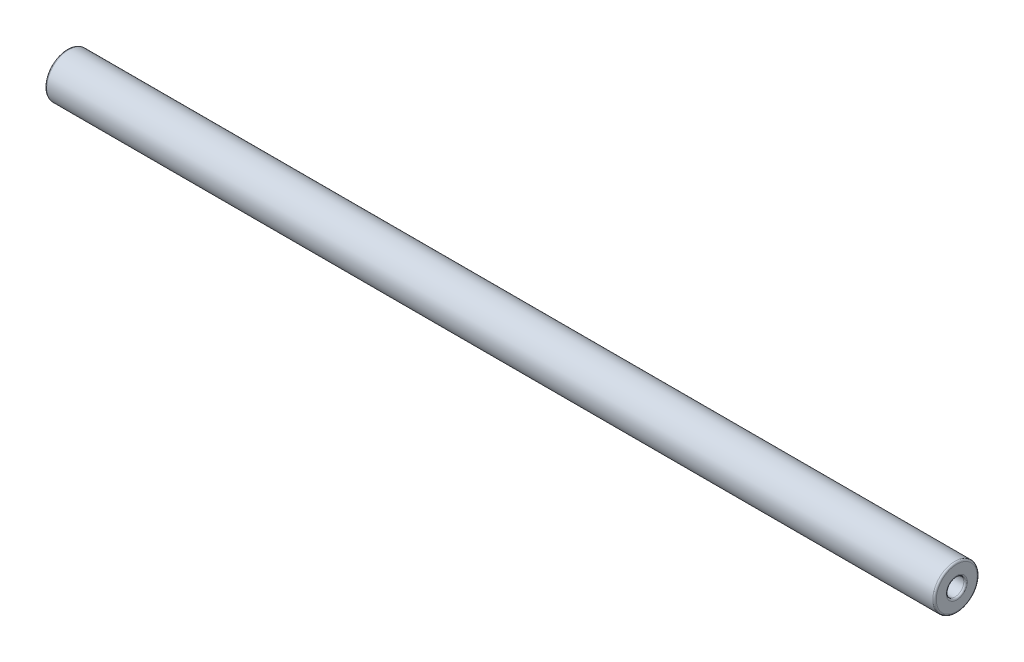
ISO-10303-21;
HEADER;
FILE_DESCRIPTION(('STEP AP214'),'2;1');
FILE_NAME('part.step','',(''),(''),'','','');
FILE_SCHEMA(('AUTOMOTIVE_DESIGN { 1 0 10303 214 1 1 1 1 }'));
ENDSEC;
DATA;
#1=APPLICATION_CONTEXT('core data for automotive mechanical design processes');
#2=APPLICATION_PROTOCOL_DEFINITION('international standard','automotive_design',2000,#1);
#3=PRODUCT_CONTEXT('',#1,'mechanical');
#4=PRODUCT('Part','Part','',(#3));
#5=PRODUCT_RELATED_PRODUCT_CATEGORY('part','',(#4));
#6=PRODUCT_DEFINITION_FORMATION('','',#4);
#7=PRODUCT_DEFINITION_CONTEXT('part definition',#1,'design');
#8=PRODUCT_DEFINITION('design','',#6,#7);
#9=PRODUCT_DEFINITION_SHAPE('','',#8);
#10=(LENGTH_UNIT() NAMED_UNIT(*) SI_UNIT(.MILLI.,.METRE.));
#11=(NAMED_UNIT(*) PLANE_ANGLE_UNIT() SI_UNIT($,.RADIAN.));
#12=(NAMED_UNIT(*) SI_UNIT($,.STERADIAN.) SOLID_ANGLE_UNIT());
#13=UNCERTAINTY_MEASURE_WITH_UNIT(LENGTH_MEASURE(1.E-05),#10,'distance_accuracy_value','');
#14=(GEOMETRIC_REPRESENTATION_CONTEXT(3) GLOBAL_UNCERTAINTY_ASSIGNED_CONTEXT((#13)) GLOBAL_UNIT_ASSIGNED_CONTEXT((#10,
#11,#12)) REPRESENTATION_CONTEXT('',''));
#15=CARTESIAN_POINT('',(0.,0.,0.));
#16=DIRECTION('',(0.,0.,1.));
#17=DIRECTION('',(1.,0.,0.));
#18=AXIS2_PLACEMENT_3D('',#15,#16,#17);
#19=CARTESIAN_POINT('',(127.,0.,0.));
#20=DIRECTION('',(1.,0.,0.));
#21=DIRECTION('',(0.,0.,-1.));
#22=AXIS2_PLACEMENT_3D('',#19,#20,#21);
#23=PLANE('',#22);
#24=CARTESIAN_POINT('',(127.,0.,0.));
#25=DIRECTION('',(1.,0.,0.));
#26=DIRECTION('',(0.,0.,-1.));
#27=AXIS2_PLACEMENT_3D('',#24,#25,#26);
#28=CIRCLE('',#27,3.);
#29=CARTESIAN_POINT('',(127.,0.,-3.));
#30=VERTEX_POINT('',#29);
#31=EDGE_CURVE('E10',#30,#30,#28,.F.);
#32=ORIENTED_EDGE('',*,*,#31,.T.);
#33=EDGE_LOOP('',(#32));
#34=FACE_BOUND('',#33,.T.);
#35=CARTESIAN_POINT('',(127.,0.,0.));
#36=DIRECTION('',(1.,0.,0.));
#37=DIRECTION('',(0.,0.,-1.));
#38=AXIS2_PLACEMENT_3D('',#35,#36,#37);
#39=CIRCLE('',#38,5.85);
#40=CARTESIAN_POINT('',(127.,0.,-5.85));
#41=VERTEX_POINT('',#40);
#42=EDGE_CURVE('E45',#41,#41,#39,.T.);
#43=ORIENTED_EDGE('',*,*,#42,.T.);
#44=EDGE_LOOP('',(#43));
#45=FACE_BOUND('',#44,.T.);
#46=ADVANCED_FACE('F37',(#34,#45),#23,.T.);
#47=CARTESIAN_POINT('',(-127.,0.,0.));
#48=DIRECTION('',(1.,0.,0.));
#49=DIRECTION('',(0.,0.,-1.));
#50=AXIS2_PLACEMENT_3D('',#47,#48,#49);
#51=PLANE('',#50);
#52=CARTESIAN_POINT('',(-127.,0.,0.));
#53=DIRECTION('',(1.,0.,0.));
#54=DIRECTION('',(0.,0.,-1.));
#55=AXIS2_PLACEMENT_3D('',#52,#53,#54);
#56=CIRCLE('',#55,3.);
#57=CARTESIAN_POINT('',(-127.,0.,-3.));
#58=VERTEX_POINT('',#57);
#59=EDGE_CURVE('E69',#58,#58,#56,.T.);
#60=ORIENTED_EDGE('',*,*,#59,.T.);
#61=EDGE_LOOP('',(#60));
#62=FACE_BOUND('',#61,.T.);
#63=CARTESIAN_POINT('',(-127.,0.,0.));
#64=DIRECTION('',(1.,0.,0.));
#65=DIRECTION('',(0.,0.,-1.));
#66=AXIS2_PLACEMENT_3D('',#63,#64,#65);
#67=CIRCLE('',#66,5.85);
#68=CARTESIAN_POINT('',(-127.,0.,-5.85));
#69=VERTEX_POINT('',#68);
#70=EDGE_CURVE('E73',#69,#69,#67,.F.);
#71=ORIENTED_EDGE('',*,*,#70,.T.);
#72=EDGE_LOOP('',(#71));
#73=FACE_BOUND('',#72,.T.);
#74=ADVANCED_FACE('F78',(#62,#73),#51,.F.);
#75=CARTESIAN_POINT('',(127.,0.,0.));
#76=DIRECTION('',(-1.,0.,0.));
#77=DIRECTION('',(0.,0.,1.));
#78=AXIS2_PLACEMENT_3D('',#75,#76,#77);
#79=CYLINDRICAL_SURFACE('',#78,6.35);
#80=CARTESIAN_POINT('',(-126.5,0.,0.));
#81=DIRECTION('',(1.,0.,0.));
#82=DIRECTION('',(0.,0.,-1.));
#83=AXIS2_PLACEMENT_3D('',#80,#81,#82);
#84=CIRCLE('',#83,6.35);
#85=CARTESIAN_POINT('',(-126.5,0.,-6.35));
#86=VERTEX_POINT('',#85);
#87=EDGE_CURVE('E50',#86,#86,#84,.T.);
#88=ORIENTED_EDGE('',*,*,#87,.T.);
#89=EDGE_LOOP('',(#88));
#90=FACE_BOUND('',#89,.T.);
#91=CARTESIAN_POINT('',(126.5,0.,0.));
#92=DIRECTION('',(1.,0.,0.));
#93=DIRECTION('',(0.,0.,-1.));
#94=AXIS2_PLACEMENT_3D('',#91,#92,#93);
#95=CIRCLE('',#94,6.35);
#96=CARTESIAN_POINT('',(126.5,0.,-6.35));
#97=VERTEX_POINT('',#96);
#98=EDGE_CURVE('E55',#97,#97,#95,.F.);
#99=ORIENTED_EDGE('',*,*,#98,.T.);
#100=EDGE_LOOP('',(#99));
#101=FACE_BOUND('',#100,.T.);
#102=ADVANCED_FACE('F88',(#90,#101),#79,.T.);
#103=CARTESIAN_POINT('',(127.,0.,0.));
#104=DIRECTION('',(-1.,0.,0.));
#105=DIRECTION('',(0.,0.,1.));
#106=AXIS2_PLACEMENT_3D('',#103,#104,#105);
#107=CYLINDRICAL_SURFACE('',#106,2.5);
#108=CARTESIAN_POINT('',(-126.5,0.,0.));
#109=DIRECTION('',(1.,0.,0.));
#110=DIRECTION('',(0.,0.,-1.));
#111=AXIS2_PLACEMENT_3D('',#108,#109,#110);
#112=CIRCLE('',#111,2.5);
#113=CARTESIAN_POINT('',(-126.5,0.,-2.5));
#114=VERTEX_POINT('',#113);
#115=EDGE_CURVE('E61',#114,#114,#112,.F.);
#116=ORIENTED_EDGE('',*,*,#115,.T.);
#117=EDGE_LOOP('',(#116));
#118=FACE_BOUND('',#117,.T.);
#119=CARTESIAN_POINT('',(126.5,0.,0.));
#120=DIRECTION('',(1.,0.,0.));
#121=DIRECTION('',(0.,0.,-1.));
#122=AXIS2_PLACEMENT_3D('',#119,#120,#121);
#123=CIRCLE('',#122,2.5);
#124=CARTESIAN_POINT('',(126.5,0.,-2.5));
#125=VERTEX_POINT('',#124);
#126=EDGE_CURVE('E65',#125,#125,#123,.T.);
#127=ORIENTED_EDGE('',*,*,#126,.T.);
#128=EDGE_LOOP('',(#127));
#129=FACE_BOUND('',#128,.T.);
#130=ADVANCED_FACE('F91',(#118,#129),#107,.F.);
#131=CARTESIAN_POINT('',(-126.5,0.,0.));
#132=DIRECTION('',(1.,0.,0.));
#133=DIRECTION('',(0.,0.,-1.));
#134=AXIS2_PLACEMENT_3D('',#131,#132,#133);
#135=TOROIDAL_SURFACE('',#134,3.,0.5);
#136=ORIENTED_EDGE('',*,*,#115,.F.);
#137=EDGE_LOOP('',(#136));
#138=FACE_BOUND('',#137,.T.);
#139=ORIENTED_EDGE('',*,*,#59,.F.);
#140=EDGE_LOOP('',(#139));
#141=FACE_BOUND('',#140,.T.);
#142=ADVANCED_FACE('F84',(#138,#141),#135,.T.);
#143=CARTESIAN_POINT('',(-126.5,0.,0.));
#144=DIRECTION('',(1.,0.,0.));
#145=DIRECTION('',(0.,0.,-1.));
#146=AXIS2_PLACEMENT_3D('',#143,#144,#145);
#147=TOROIDAL_SURFACE('',#146,5.85,0.5);
#148=ORIENTED_EDGE('',*,*,#70,.F.);
#149=EDGE_LOOP('',(#148));
#150=FACE_BOUND('',#149,.T.);
#151=ORIENTED_EDGE('',*,*,#87,.F.);
#152=EDGE_LOOP('',(#151));
#153=FACE_BOUND('',#152,.T.);
#154=ADVANCED_FACE('F80',(#150,#153),#147,.T.);
#155=CARTESIAN_POINT('',(126.5,0.,0.));
#156=DIRECTION('',(1.,0.,0.));
#157=DIRECTION('',(0.,0.,-1.));
#158=AXIS2_PLACEMENT_3D('',#155,#156,#157);
#159=TOROIDAL_SURFACE('',#158,3.,0.5);
#160=ORIENTED_EDGE('',*,*,#31,.F.);
#161=EDGE_LOOP('',(#160));
#162=FACE_BOUND('',#161,.T.);
#163=ORIENTED_EDGE('',*,*,#126,.F.);
#164=EDGE_LOOP('',(#163));
#165=FACE_BOUND('',#164,.T.);
#166=ADVANCED_FACE('F83',(#162,#165),#159,.T.);
#167=CARTESIAN_POINT('',(126.5,0.,0.));
#168=DIRECTION('',(1.,0.,0.));
#169=DIRECTION('',(0.,0.,-1.));
#170=AXIS2_PLACEMENT_3D('',#167,#168,#169);
#171=TOROIDAL_SURFACE('',#170,5.85,0.5);
#172=ORIENTED_EDGE('',*,*,#98,.F.);
#173=EDGE_LOOP('',(#172));
#174=FACE_BOUND('',#173,.T.);
#175=ORIENTED_EDGE('',*,*,#42,.F.);
#176=EDGE_LOOP('',(#175));
#177=FACE_BOUND('',#176,.T.);
#178=ADVANCED_FACE('F39',(#174,#177),#171,.T.);
#179=CLOSED_SHELL('',(#46,#74,#102,#130,#142,#154,#166,#178));
#180=MANIFOLD_SOLID_BREP('B2',#179);
#181=ADVANCED_BREP_SHAPE_REPRESENTATION('',(#18,#180),#14);
#182=SHAPE_DEFINITION_REPRESENTATION(#9,#181);
ENDSEC;
END-ISO-10303-21;
